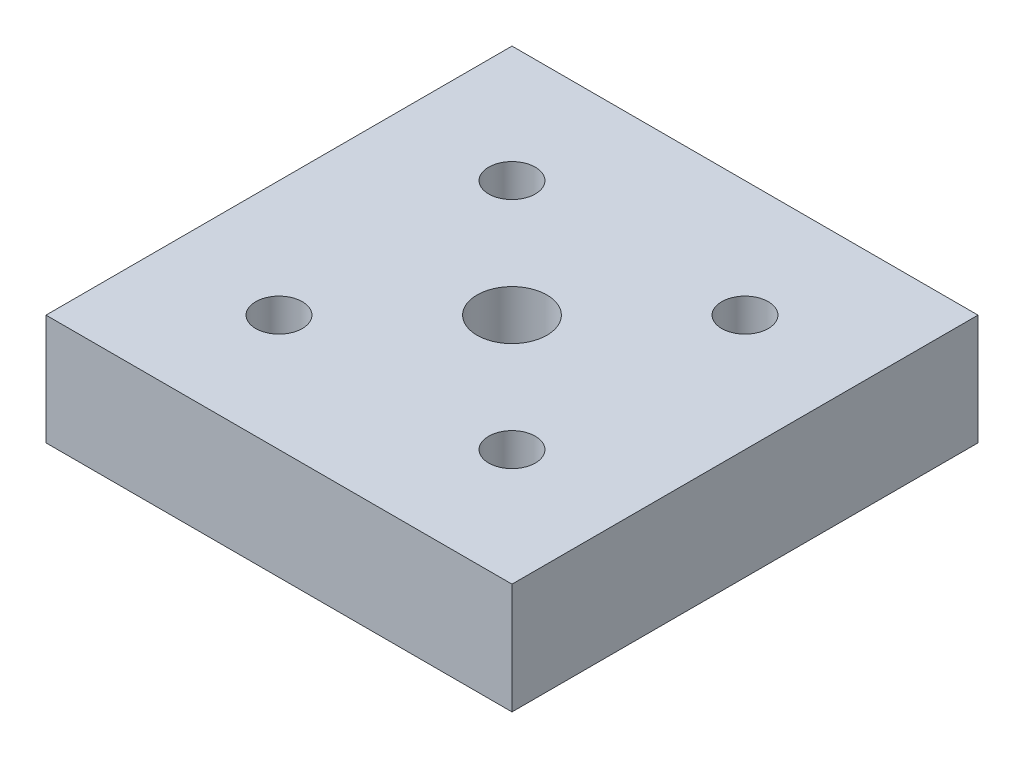
ISO-10303-21;
HEADER;
FILE_DESCRIPTION(('STEP AP214'),'2;1');
FILE_NAME('part.step','',(''),(''),'','','');
FILE_SCHEMA(('AUTOMOTIVE_DESIGN { 1 0 10303 214 1 1 1 1 }'));
ENDSEC;
DATA;
#1=APPLICATION_CONTEXT('core data for automotive mechanical design processes');
#2=APPLICATION_PROTOCOL_DEFINITION('international standard','automotive_design',2000,#1);
#3=PRODUCT_CONTEXT('',#1,'mechanical');
#4=PRODUCT('Part','Part','',(#3));
#5=PRODUCT_RELATED_PRODUCT_CATEGORY('part','',(#4));
#6=PRODUCT_DEFINITION_FORMATION('','',#4);
#7=PRODUCT_DEFINITION_CONTEXT('part definition',#1,'design');
#8=PRODUCT_DEFINITION('design','',#6,#7);
#9=PRODUCT_DEFINITION_SHAPE('','',#8);
#10=(LENGTH_UNIT() NAMED_UNIT(*) SI_UNIT(.MILLI.,.METRE.));
#11=(NAMED_UNIT(*) PLANE_ANGLE_UNIT() SI_UNIT($,.RADIAN.));
#12=(NAMED_UNIT(*) SI_UNIT($,.STERADIAN.) SOLID_ANGLE_UNIT());
#13=UNCERTAINTY_MEASURE_WITH_UNIT(LENGTH_MEASURE(1.E-05),#10,'distance_accuracy_value','');
#14=(GEOMETRIC_REPRESENTATION_CONTEXT(3) GLOBAL_UNCERTAINTY_ASSIGNED_CONTEXT((#13)) GLOBAL_UNIT_ASSIGNED_CONTEXT((#10,
#11,#12)) REPRESENTATION_CONTEXT('',''));
#15=CARTESIAN_POINT('',(0.,0.,0.));
#16=DIRECTION('',(0.,0.,1.));
#17=DIRECTION('',(1.,0.,0.));
#18=AXIS2_PLACEMENT_3D('',#15,#16,#17);
#19=CARTESIAN_POINT('',(0.,19.,0.));
#20=DIRECTION('',(0.,1.,0.));
#21=DIRECTION('',(0.,0.,1.));
#22=AXIS2_PLACEMENT_3D('',#19,#20,#21);
#23=PLANE('',#22);
#24=CARTESIAN_POINT('',(-20.,19.,20.));
#25=DIRECTION('',(0.,1.,0.));
#26=DIRECTION('',(0.,0.,1.));
#27=AXIS2_PLACEMENT_3D('',#24,#25,#26);
#28=CIRCLE('',#27,4.);
#29=CARTESIAN_POINT('',(-20.,19.,24.));
#30=VERTEX_POINT('',#29);
#31=EDGE_CURVE('E129',#30,#30,#28,.T.);
#32=ORIENTED_EDGE('',*,*,#31,.F.);
#33=EDGE_LOOP('',(#32));
#34=FACE_BOUND('',#33,.T.);
#35=CARTESIAN_POINT('',(20.,19.,-20.));
#36=DIRECTION('',(0.,1.,0.));
#37=DIRECTION('',(0.,0.,1.));
#38=AXIS2_PLACEMENT_3D('',#35,#36,#37);
#39=CIRCLE('',#38,4.);
#40=CARTESIAN_POINT('',(20.,19.,-16.));
#41=VERTEX_POINT('',#40);
#42=EDGE_CURVE('E138',#41,#41,#39,.T.);
#43=ORIENTED_EDGE('',*,*,#42,.F.);
#44=EDGE_LOOP('',(#43));
#45=FACE_BOUND('',#44,.T.);
#46=DIRECTION('',(0.,0.,-1.));
#47=VECTOR('',#46,1.);
#48=CARTESIAN_POINT('',(40.,19.,-40.));
#49=LINE('',#48,#47);
#50=CARTESIAN_POINT('',(40.,19.,40.));
#51=VERTEX_POINT('',#50);
#52=CARTESIAN_POINT('',(40.,19.,-40.));
#53=VERTEX_POINT('',#52);
#54=EDGE_CURVE('E87',#51,#53,#49,.T.);
#55=ORIENTED_EDGE('',*,*,#54,.T.);
#56=DIRECTION('',(-1.,0.,0.));
#57=VECTOR('',#56,1.);
#58=CARTESIAN_POINT('',(-40.,19.,-40.));
#59=LINE('',#58,#57);
#60=CARTESIAN_POINT('',(-40.,19.,-40.));
#61=VERTEX_POINT('',#60);
#62=EDGE_CURVE('E82',#53,#61,#59,.T.);
#63=ORIENTED_EDGE('',*,*,#62,.T.);
#64=DIRECTION('',(0.,0.,1.));
#65=VECTOR('',#64,1.);
#66=CARTESIAN_POINT('',(-40.,19.,-40.));
#67=LINE('',#66,#65);
#68=CARTESIAN_POINT('',(-40.,19.,40.));
#69=VERTEX_POINT('',#68);
#70=EDGE_CURVE('E85',#61,#69,#67,.T.);
#71=ORIENTED_EDGE('',*,*,#70,.T.);
#72=DIRECTION('',(1.,0.,0.));
#73=VECTOR('',#72,1.);
#74=CARTESIAN_POINT('',(-40.,19.,40.));
#75=LINE('',#74,#73);
#76=EDGE_CURVE('E52',#69,#51,#75,.T.);
#77=ORIENTED_EDGE('',*,*,#76,.T.);
#78=EDGE_LOOP('',(#55,#63,#71,#77));
#79=FACE_BOUND('',#78,.T.);
#80=CARTESIAN_POINT('',(-20.,19.,-20.));
#81=DIRECTION('',(0.,1.,0.));
#82=DIRECTION('',(0.,0.,1.));
#83=AXIS2_PLACEMENT_3D('',#80,#81,#82);
#84=CIRCLE('',#83,4.);
#85=CARTESIAN_POINT('',(-20.,19.,-16.));
#86=VERTEX_POINT('',#85);
#87=EDGE_CURVE('E103',#86,#86,#84,.T.);
#88=ORIENTED_EDGE('',*,*,#87,.F.);
#89=EDGE_LOOP('',(#88));
#90=FACE_BOUND('',#89,.T.);
#91=CARTESIAN_POINT('',(20.,19.,20.));
#92=DIRECTION('',(0.,1.,0.));
#93=DIRECTION('',(0.,0.,1.));
#94=AXIS2_PLACEMENT_3D('',#91,#92,#93);
#95=CIRCLE('',#94,4.);
#96=CARTESIAN_POINT('',(20.,19.,24.));
#97=VERTEX_POINT('',#96);
#98=EDGE_CURVE('E135',#97,#97,#95,.T.);
#99=ORIENTED_EDGE('',*,*,#98,.F.);
#100=EDGE_LOOP('',(#99));
#101=FACE_BOUND('',#100,.T.);
#102=CARTESIAN_POINT('',(0.,19.,0.));
#103=DIRECTION('',(0.,1.,0.));
#104=DIRECTION('',(0.,0.,1.));
#105=AXIS2_PLACEMENT_3D('',#102,#103,#104);
#106=CIRCLE('',#105,6.);
#107=CARTESIAN_POINT('',(0.,19.,6.00000000000001));
#108=VERTEX_POINT('',#107);
#109=EDGE_CURVE('E124',#108,#108,#106,.T.);
#110=ORIENTED_EDGE('',*,*,#109,.F.);
#111=EDGE_LOOP('',(#110));
#112=FACE_BOUND('',#111,.T.);
#113=ADVANCED_FACE('F33',(#34,#45,#79,#90,#101,#112),#23,.T.);
#114=CARTESIAN_POINT('',(0.,0.,0.));
#115=DIRECTION('',(0.,1.,0.));
#116=DIRECTION('',(0.,0.,1.));
#117=AXIS2_PLACEMENT_3D('',#114,#115,#116);
#118=PLANE('',#117);
#119=CARTESIAN_POINT('',(-20.,0.,20.));
#120=DIRECTION('',(0.,1.,0.));
#121=DIRECTION('',(0.,0.,1.));
#122=AXIS2_PLACEMENT_3D('',#119,#120,#121);
#123=CIRCLE('',#122,7.);
#124=CARTESIAN_POINT('',(-20.,0.,27.));
#125=VERTEX_POINT('',#124);
#126=EDGE_CURVE('E332',#125,#125,#123,.T.);
#127=ORIENTED_EDGE('',*,*,#126,.T.);
#128=EDGE_LOOP('',(#127));
#129=FACE_BOUND('',#128,.T.);
#130=CARTESIAN_POINT('',(20.,0.,20.));
#131=DIRECTION('',(0.,1.,0.));
#132=DIRECTION('',(0.,0.,1.));
#133=AXIS2_PLACEMENT_3D('',#130,#131,#132);
#134=CIRCLE('',#133,7.);
#135=CARTESIAN_POINT('',(20.,0.,27.));
#136=VERTEX_POINT('',#135);
#137=EDGE_CURVE('E338',#136,#136,#134,.T.);
#138=ORIENTED_EDGE('',*,*,#137,.T.);
#139=EDGE_LOOP('',(#138));
#140=FACE_BOUND('',#139,.T.);
#141=CARTESIAN_POINT('',(20.,0.,-20.));
#142=DIRECTION('',(0.,1.,0.));
#143=DIRECTION('',(0.,0.,1.));
#144=AXIS2_PLACEMENT_3D('',#141,#142,#143);
#145=CIRCLE('',#144,7.);
#146=CARTESIAN_POINT('',(20.,0.,-13.));
#147=VERTEX_POINT('',#146);
#148=EDGE_CURVE('E344',#147,#147,#145,.T.);
#149=ORIENTED_EDGE('',*,*,#148,.T.);
#150=EDGE_LOOP('',(#149));
#151=FACE_BOUND('',#150,.T.);
#152=CARTESIAN_POINT('',(-20.,0.,-20.));
#153=DIRECTION('',(0.,1.,0.));
#154=DIRECTION('',(0.,0.,1.));
#155=AXIS2_PLACEMENT_3D('',#152,#153,#154);
#156=CIRCLE('',#155,7.);
#157=CARTESIAN_POINT('',(-20.,0.,-13.));
#158=VERTEX_POINT('',#157);
#159=EDGE_CURVE('E327',#158,#158,#156,.T.);
#160=ORIENTED_EDGE('',*,*,#159,.T.);
#161=EDGE_LOOP('',(#160));
#162=FACE_BOUND('',#161,.T.);
#163=DIRECTION('',(0.,0.,-1.));
#164=VECTOR('',#163,1.);
#165=CARTESIAN_POINT('',(40.,0.,-40.));
#166=LINE('',#165,#164);
#167=CARTESIAN_POINT('',(40.,0.,40.));
#168=VERTEX_POINT('',#167);
#169=CARTESIAN_POINT('',(40.,0.,-40.));
#170=VERTEX_POINT('',#169);
#171=EDGE_CURVE('E100',#168,#170,#166,.T.);
#172=ORIENTED_EDGE('',*,*,#171,.F.);
#173=DIRECTION('',(1.,0.,0.));
#174=VECTOR('',#173,1.);
#175=CARTESIAN_POINT('',(-40.,0.,40.));
#176=LINE('',#175,#174);
#177=CARTESIAN_POINT('',(-40.,0.,40.));
#178=VERTEX_POINT('',#177);
#179=EDGE_CURVE('E75',#178,#168,#176,.T.);
#180=ORIENTED_EDGE('',*,*,#179,.F.);
#181=DIRECTION('',(0.,0.,1.));
#182=VECTOR('',#181,1.);
#183=CARTESIAN_POINT('',(-40.,0.,-40.));
#184=LINE('',#183,#182);
#185=CARTESIAN_POINT('',(-40.,0.,-40.));
#186=VERTEX_POINT('',#185);
#187=EDGE_CURVE('E69',#186,#178,#184,.T.);
#188=ORIENTED_EDGE('',*,*,#187,.F.);
#189=DIRECTION('',(-1.,0.,0.));
#190=VECTOR('',#189,1.);
#191=CARTESIAN_POINT('',(-40.,0.,-40.));
#192=LINE('',#191,#190);
#193=EDGE_CURVE('E91',#170,#186,#192,.T.);
#194=ORIENTED_EDGE('',*,*,#193,.F.);
#195=EDGE_LOOP('',(#172,#180,#188,#194));
#196=FACE_BOUND('',#195,.T.);
#197=CARTESIAN_POINT('',(0.,0.,0.));
#198=DIRECTION('',(0.,1.,0.));
#199=DIRECTION('',(0.,0.,1.));
#200=AXIS2_PLACEMENT_3D('',#197,#198,#199);
#201=CIRCLE('',#200,6.);
#202=CARTESIAN_POINT('',(0.,0.,6.00000000000001));
#203=VERTEX_POINT('',#202);
#204=EDGE_CURVE('E120',#203,#203,#201,.T.);
#205=ORIENTED_EDGE('',*,*,#204,.T.);
#206=EDGE_LOOP('',(#205));
#207=FACE_BOUND('',#206,.T.);
#208=ADVANCED_FACE('F147',(#129,#140,#151,#162,#196,#207),#118,.F.);
#209=CARTESIAN_POINT('',(40.,19.,-40.));
#210=DIRECTION('',(-1.,0.,0.));
#211=DIRECTION('',(0.,0.,1.));
#212=AXIS2_PLACEMENT_3D('',#209,#210,#211);
#213=PLANE('',#212);
#214=ORIENTED_EDGE('',*,*,#171,.T.);
#215=DIRECTION('',(0.,-1.,0.));
#216=VECTOR('',#215,1.);
#217=CARTESIAN_POINT('',(40.,19.,-40.));
#218=LINE('',#217,#216);
#219=EDGE_CURVE('E11',#53,#170,#218,.T.);
#220=ORIENTED_EDGE('',*,*,#219,.F.);
#221=ORIENTED_EDGE('',*,*,#54,.F.);
#222=DIRECTION('',(0.,-1.,0.));
#223=VECTOR('',#222,1.);
#224=CARTESIAN_POINT('',(40.,19.,40.));
#225=LINE('',#224,#223);
#226=EDGE_CURVE('E96',#51,#168,#225,.T.);
#227=ORIENTED_EDGE('',*,*,#226,.T.);
#228=EDGE_LOOP('',(#214,#220,#221,#227));
#229=FACE_BOUND('',#228,.T.);
#230=ADVANCED_FACE('F35',(#229),#213,.F.);
#231=CARTESIAN_POINT('',(-40.,19.,-40.));
#232=DIRECTION('',(0.,0.,1.));
#233=DIRECTION('',(1.,0.,0.));
#234=AXIS2_PLACEMENT_3D('',#231,#232,#233);
#235=PLANE('',#234);
#236=ORIENTED_EDGE('',*,*,#193,.T.);
#237=DIRECTION('',(0.,-1.,0.));
#238=VECTOR('',#237,1.);
#239=CARTESIAN_POINT('',(-40.,19.,-40.));
#240=LINE('',#239,#238);
#241=EDGE_CURVE('E43',#61,#186,#240,.T.);
#242=ORIENTED_EDGE('',*,*,#241,.F.);
#243=ORIENTED_EDGE('',*,*,#62,.F.);
#244=ORIENTED_EDGE('',*,*,#219,.T.);
#245=EDGE_LOOP('',(#236,#242,#243,#244));
#246=FACE_BOUND('',#245,.T.);
#247=ADVANCED_FACE('F90',(#246),#235,.F.);
#248=CARTESIAN_POINT('',(-40.,19.,-40.));
#249=DIRECTION('',(1.,0.,0.));
#250=DIRECTION('',(0.,0.,-1.));
#251=AXIS2_PLACEMENT_3D('',#248,#249,#250);
#252=PLANE('',#251);
#253=ORIENTED_EDGE('',*,*,#187,.T.);
#254=DIRECTION('',(0.,-1.,0.));
#255=VECTOR('',#254,1.);
#256=CARTESIAN_POINT('',(-40.,19.,40.));
#257=LINE('',#256,#255);
#258=EDGE_CURVE('E92',#69,#178,#257,.T.);
#259=ORIENTED_EDGE('',*,*,#258,.F.);
#260=ORIENTED_EDGE('',*,*,#70,.F.);
#261=ORIENTED_EDGE('',*,*,#241,.T.);
#262=EDGE_LOOP('',(#253,#259,#260,#261));
#263=FACE_BOUND('',#262,.T.);
#264=ADVANCED_FACE('F94',(#263),#252,.F.);
#265=CARTESIAN_POINT('',(-40.,19.,40.));
#266=DIRECTION('',(0.,0.,-1.));
#267=DIRECTION('',(-1.,0.,0.));
#268=AXIS2_PLACEMENT_3D('',#265,#266,#267);
#269=PLANE('',#268);
#270=ORIENTED_EDGE('',*,*,#179,.T.);
#271=ORIENTED_EDGE('',*,*,#226,.F.);
#272=ORIENTED_EDGE('',*,*,#76,.F.);
#273=ORIENTED_EDGE('',*,*,#258,.T.);
#274=EDGE_LOOP('',(#270,#271,#272,#273));
#275=FACE_BOUND('',#274,.T.);
#276=ADVANCED_FACE('F182',(#275),#269,.F.);
#277=CARTESIAN_POINT('',(-20.,19.,-20.));
#278=DIRECTION('',(0.,-1.,0.));
#279=DIRECTION('',(0.,0.,-1.));
#280=AXIS2_PLACEMENT_3D('',#277,#278,#279);
#281=CYLINDRICAL_SURFACE('',#280,4.);
#282=CARTESIAN_POINT('',(-20.,8.,-20.));
#283=DIRECTION('',(0.,1.,0.));
#284=DIRECTION('',(0.,0.,1.));
#285=AXIS2_PLACEMENT_3D('',#282,#283,#284);
#286=CIRCLE('',#285,4.);
#287=CARTESIAN_POINT('',(-20.,8.,-16.));
#288=VERTEX_POINT('',#287);
#289=EDGE_CURVE('E37',#288,#288,#286,.T.);
#290=ORIENTED_EDGE('',*,*,#289,.F.);
#291=EDGE_LOOP('',(#290));
#292=FACE_BOUND('',#291,.T.);
#293=ORIENTED_EDGE('',*,*,#87,.T.);
#294=EDGE_LOOP('',(#293));
#295=FACE_BOUND('',#294,.T.);
#296=ADVANCED_FACE('F144',(#292,#295),#281,.F.);
#297=CARTESIAN_POINT('',(20.,19.,-20.));
#298=DIRECTION('',(0.,-1.,0.));
#299=DIRECTION('',(0.,0.,-1.));
#300=AXIS2_PLACEMENT_3D('',#297,#298,#299);
#301=CYLINDRICAL_SURFACE('',#300,4.);
#302=CARTESIAN_POINT('',(20.,8.,-20.));
#303=DIRECTION('',(0.,1.,0.));
#304=DIRECTION('',(0.,0.,1.));
#305=AXIS2_PLACEMENT_3D('',#302,#303,#304);
#306=CIRCLE('',#305,4.);
#307=CARTESIAN_POINT('',(20.,8.,-16.));
#308=VERTEX_POINT('',#307);
#309=EDGE_CURVE('E115',#308,#308,#306,.T.);
#310=ORIENTED_EDGE('',*,*,#309,.F.);
#311=EDGE_LOOP('',(#310));
#312=FACE_BOUND('',#311,.T.);
#313=ORIENTED_EDGE('',*,*,#42,.T.);
#314=EDGE_LOOP('',(#313));
#315=FACE_BOUND('',#314,.T.);
#316=ADVANCED_FACE('F176',(#312,#315),#301,.F.);
#317=CARTESIAN_POINT('',(20.,19.,20.));
#318=DIRECTION('',(0.,-1.,0.));
#319=DIRECTION('',(0.,0.,-1.));
#320=AXIS2_PLACEMENT_3D('',#317,#318,#319);
#321=CYLINDRICAL_SURFACE('',#320,4.);
#322=CARTESIAN_POINT('',(20.,8.,20.));
#323=DIRECTION('',(0.,1.,0.));
#324=DIRECTION('',(0.,0.,1.));
#325=AXIS2_PLACEMENT_3D('',#322,#323,#324);
#326=CIRCLE('',#325,4.);
#327=CARTESIAN_POINT('',(20.,8.,24.));
#328=VERTEX_POINT('',#327);
#329=EDGE_CURVE('E112',#328,#328,#326,.T.);
#330=ORIENTED_EDGE('',*,*,#329,.F.);
#331=EDGE_LOOP('',(#330));
#332=FACE_BOUND('',#331,.T.);
#333=ORIENTED_EDGE('',*,*,#98,.T.);
#334=EDGE_LOOP('',(#333));
#335=FACE_BOUND('',#334,.T.);
#336=ADVANCED_FACE('F167',(#332,#335),#321,.F.);
#337=CARTESIAN_POINT('',(-20.,19.,20.));
#338=DIRECTION('',(0.,-1.,0.));
#339=DIRECTION('',(0.,0.,-1.));
#340=AXIS2_PLACEMENT_3D('',#337,#338,#339);
#341=CYLINDRICAL_SURFACE('',#340,4.);
#342=CARTESIAN_POINT('',(-20.,8.,20.));
#343=DIRECTION('',(0.,1.,0.));
#344=DIRECTION('',(0.,0.,1.));
#345=AXIS2_PLACEMENT_3D('',#342,#343,#344);
#346=CIRCLE('',#345,4.);
#347=CARTESIAN_POINT('',(-20.,8.,24.));
#348=VERTEX_POINT('',#347);
#349=EDGE_CURVE('E109',#348,#348,#346,.T.);
#350=ORIENTED_EDGE('',*,*,#349,.F.);
#351=EDGE_LOOP('',(#350));
#352=FACE_BOUND('',#351,.T.);
#353=ORIENTED_EDGE('',*,*,#31,.T.);
#354=EDGE_LOOP('',(#353));
#355=FACE_BOUND('',#354,.T.);
#356=ADVANCED_FACE('F158',(#352,#355),#341,.F.);
#357=CARTESIAN_POINT('',(0.,19.,0.));
#358=DIRECTION('',(0.,-1.,0.));
#359=DIRECTION('',(0.,0.,-1.));
#360=AXIS2_PLACEMENT_3D('',#357,#358,#359);
#361=CYLINDRICAL_SURFACE('',#360,6.);
#362=ORIENTED_EDGE('',*,*,#109,.T.);
#363=EDGE_LOOP('',(#362));
#364=FACE_BOUND('',#363,.T.);
#365=ORIENTED_EDGE('',*,*,#204,.F.);
#366=EDGE_LOOP('',(#365));
#367=FACE_BOUND('',#366,.T.);
#368=ADVANCED_FACE('F154',(#364,#367),#361,.F.);
#369=CARTESIAN_POINT('',(-20.,8.,20.));
#370=DIRECTION('',(0.,-1.,0.));
#371=DIRECTION('',(0.,0.,-1.));
#372=AXIS2_PLACEMENT_3D('',#369,#370,#371);
#373=CYLINDRICAL_SURFACE('',#372,7.);
#374=CARTESIAN_POINT('',(-20.,8.,20.));
#375=DIRECTION('',(0.,1.,0.));
#376=DIRECTION('',(0.,0.,1.));
#377=AXIS2_PLACEMENT_3D('',#374,#375,#376);
#378=CIRCLE('',#377,7.);
#379=CARTESIAN_POINT('',(-20.,8.,27.));
#380=VERTEX_POINT('',#379);
#381=EDGE_CURVE('E335',#380,#380,#378,.T.);
#382=ORIENTED_EDGE('',*,*,#381,.T.);
#383=EDGE_LOOP('',(#382));
#384=FACE_BOUND('',#383,.T.);
#385=ORIENTED_EDGE('',*,*,#126,.F.);
#386=EDGE_LOOP('',(#385));
#387=FACE_BOUND('',#386,.T.);
#388=ADVANCED_FACE('F157',(#384,#387),#373,.F.);
#389=CARTESIAN_POINT('',(-20.,8.,20.));
#390=DIRECTION('',(0.,1.,0.));
#391=DIRECTION('',(0.,0.,1.));
#392=AXIS2_PLACEMENT_3D('',#389,#390,#391);
#393=PLANE('',#392);
#394=ORIENTED_EDGE('',*,*,#349,.T.);
#395=EDGE_LOOP('',(#394));
#396=FACE_BOUND('',#395,.T.);
#397=ORIENTED_EDGE('',*,*,#381,.F.);
#398=EDGE_LOOP('',(#397));
#399=FACE_BOUND('',#398,.T.);
#400=ADVANCED_FACE('F164',(#396,#399),#393,.F.);
#401=CARTESIAN_POINT('',(20.,8.,20.));
#402=DIRECTION('',(0.,-1.,0.));
#403=DIRECTION('',(0.,0.,-1.));
#404=AXIS2_PLACEMENT_3D('',#401,#402,#403);
#405=CYLINDRICAL_SURFACE('',#404,7.);
#406=CARTESIAN_POINT('',(20.,8.,20.));
#407=DIRECTION('',(0.,1.,0.));
#408=DIRECTION('',(0.,0.,1.));
#409=AXIS2_PLACEMENT_3D('',#406,#407,#408);
#410=CIRCLE('',#409,7.);
#411=CARTESIAN_POINT('',(20.,8.,27.));
#412=VERTEX_POINT('',#411);
#413=EDGE_CURVE('E341',#412,#412,#410,.T.);
#414=ORIENTED_EDGE('',*,*,#413,.T.);
#415=EDGE_LOOP('',(#414));
#416=FACE_BOUND('',#415,.T.);
#417=ORIENTED_EDGE('',*,*,#137,.F.);
#418=EDGE_LOOP('',(#417));
#419=FACE_BOUND('',#418,.T.);
#420=ADVANCED_FACE('F265',(#416,#419),#405,.F.);
#421=CARTESIAN_POINT('',(20.,8.,20.));
#422=DIRECTION('',(0.,1.,0.));
#423=DIRECTION('',(0.,0.,1.));
#424=AXIS2_PLACEMENT_3D('',#421,#422,#423);
#425=PLANE('',#424);
#426=ORIENTED_EDGE('',*,*,#329,.T.);
#427=EDGE_LOOP('',(#426));
#428=FACE_BOUND('',#427,.T.);
#429=ORIENTED_EDGE('',*,*,#413,.F.);
#430=EDGE_LOOP('',(#429));
#431=FACE_BOUND('',#430,.T.);
#432=ADVANCED_FACE('F274',(#428,#431),#425,.F.);
#433=CARTESIAN_POINT('',(20.,8.,-20.));
#434=DIRECTION('',(0.,-1.,0.));
#435=DIRECTION('',(0.,0.,-1.));
#436=AXIS2_PLACEMENT_3D('',#433,#434,#435);
#437=CYLINDRICAL_SURFACE('',#436,7.);
#438=CARTESIAN_POINT('',(20.,8.,-20.));
#439=DIRECTION('',(0.,1.,0.));
#440=DIRECTION('',(0.,0.,1.));
#441=AXIS2_PLACEMENT_3D('',#438,#439,#440);
#442=CIRCLE('',#441,7.);
#443=CARTESIAN_POINT('',(20.,8.,-13.));
#444=VERTEX_POINT('',#443);
#445=EDGE_CURVE('E330',#444,#444,#442,.T.);
#446=ORIENTED_EDGE('',*,*,#445,.T.);
#447=EDGE_LOOP('',(#446));
#448=FACE_BOUND('',#447,.T.);
#449=ORIENTED_EDGE('',*,*,#148,.F.);
#450=EDGE_LOOP('',(#449));
#451=FACE_BOUND('',#450,.T.);
#452=ADVANCED_FACE('F283',(#448,#451),#437,.F.);
#453=CARTESIAN_POINT('',(20.,8.,-20.));
#454=DIRECTION('',(0.,1.,0.));
#455=DIRECTION('',(0.,0.,1.));
#456=AXIS2_PLACEMENT_3D('',#453,#454,#455);
#457=PLANE('',#456);
#458=ORIENTED_EDGE('',*,*,#309,.T.);
#459=EDGE_LOOP('',(#458));
#460=FACE_BOUND('',#459,.T.);
#461=ORIENTED_EDGE('',*,*,#445,.F.);
#462=EDGE_LOOP('',(#461));
#463=FACE_BOUND('',#462,.T.);
#464=ADVANCED_FACE('F292',(#460,#463),#457,.F.);
#465=CARTESIAN_POINT('',(-20.,8.,-20.));
#466=DIRECTION('',(0.,-1.,0.));
#467=DIRECTION('',(0.,0.,-1.));
#468=AXIS2_PLACEMENT_3D('',#465,#466,#467);
#469=CYLINDRICAL_SURFACE('',#468,7.);
#470=CARTESIAN_POINT('',(-20.,8.,-20.));
#471=DIRECTION('',(0.,1.,0.));
#472=DIRECTION('',(0.,0.,1.));
#473=AXIS2_PLACEMENT_3D('',#470,#471,#472);
#474=CIRCLE('',#473,7.);
#475=CARTESIAN_POINT('',(-20.,8.,-13.));
#476=VERTEX_POINT('',#475);
#477=EDGE_CURVE('E113',#476,#476,#474,.T.);
#478=ORIENTED_EDGE('',*,*,#477,.T.);
#479=EDGE_LOOP('',(#478));
#480=FACE_BOUND('',#479,.T.);
#481=ORIENTED_EDGE('',*,*,#159,.F.);
#482=EDGE_LOOP('',(#481));
#483=FACE_BOUND('',#482,.T.);
#484=ADVANCED_FACE('F171',(#480,#483),#469,.F.);
#485=CARTESIAN_POINT('',(-20.,8.,-20.));
#486=DIRECTION('',(0.,1.,0.));
#487=DIRECTION('',(0.,0.,1.));
#488=AXIS2_PLACEMENT_3D('',#485,#486,#487);
#489=PLANE('',#488);
#490=ORIENTED_EDGE('',*,*,#289,.T.);
#491=EDGE_LOOP('',(#490));
#492=FACE_BOUND('',#491,.T.);
#493=ORIENTED_EDGE('',*,*,#477,.F.);
#494=EDGE_LOOP('',(#493));
#495=FACE_BOUND('',#494,.T.);
#496=ADVANCED_FACE('F308',(#492,#495),#489,.F.);
#497=CLOSED_SHELL('',(#113,#208,#230,#247,#264,#276,#296,#316,#336,#356,#368,#388,#400,#420,
#432,#452,#464,#484,#496));
#498=MANIFOLD_SOLID_BREP('B2',#497);
#499=ADVANCED_BREP_SHAPE_REPRESENTATION('',(#18,#498),#14);
#500=SHAPE_DEFINITION_REPRESENTATION(#9,#499);
ENDSEC;
END-ISO-10303-21;
